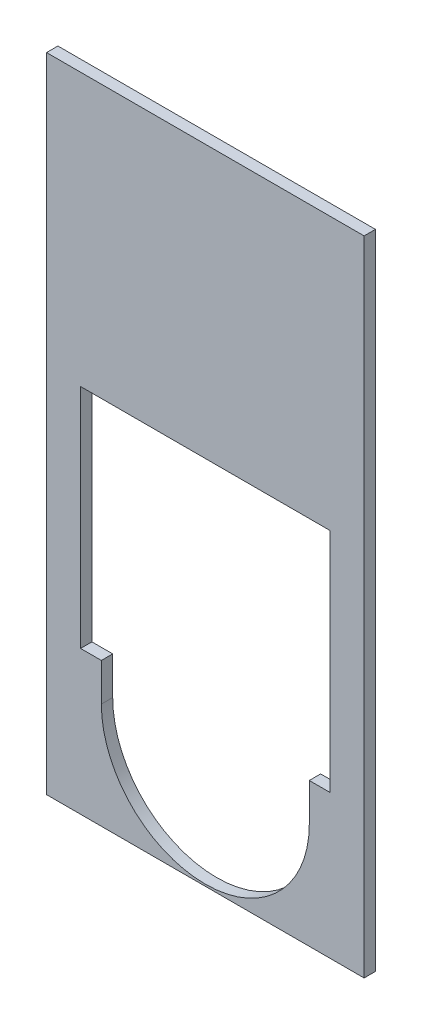
ISO-10303-21;
HEADER;
FILE_DESCRIPTION(('STEP AP214'),'2;1');
FILE_NAME('part.step','',(''),(''),'','','');
FILE_SCHEMA(('AUTOMOTIVE_DESIGN { 1 0 10303 214 1 1 1 1 }'));
ENDSEC;
DATA;
#1=APPLICATION_CONTEXT('core data for automotive mechanical design processes');
#2=APPLICATION_PROTOCOL_DEFINITION('international standard','automotive_design',2000,#1);
#3=PRODUCT_CONTEXT('',#1,'mechanical');
#4=PRODUCT('Part','Part','',(#3));
#5=PRODUCT_RELATED_PRODUCT_CATEGORY('part','',(#4));
#6=PRODUCT_DEFINITION_FORMATION('','',#4);
#7=PRODUCT_DEFINITION_CONTEXT('part definition',#1,'design');
#8=PRODUCT_DEFINITION('design','',#6,#7);
#9=PRODUCT_DEFINITION_SHAPE('','',#8);
#10=(LENGTH_UNIT() NAMED_UNIT(*) SI_UNIT(.MILLI.,.METRE.));
#11=(NAMED_UNIT(*) PLANE_ANGLE_UNIT() SI_UNIT($,.RADIAN.));
#12=(NAMED_UNIT(*) SI_UNIT($,.STERADIAN.) SOLID_ANGLE_UNIT());
#13=UNCERTAINTY_MEASURE_WITH_UNIT(LENGTH_MEASURE(1.E-05),#10,'distance_accuracy_value','');
#14=(GEOMETRIC_REPRESENTATION_CONTEXT(3) GLOBAL_UNCERTAINTY_ASSIGNED_CONTEXT((#13)) GLOBAL_UNIT_ASSIGNED_CONTEXT((#10,
#11,#12)) REPRESENTATION_CONTEXT('',''));
#15=CARTESIAN_POINT('',(0.,0.,0.));
#16=DIRECTION('',(0.,0.,1.));
#17=DIRECTION('',(1.,0.,0.));
#18=AXIS2_PLACEMENT_3D('',#15,#16,#17);
#19=CARTESIAN_POINT('',(0.,0.,3.));
#20=DIRECTION('',(1.,0.,0.));
#21=DIRECTION('',(0.,1.,0.));
#22=AXIS2_PLACEMENT_3D('',#19,#20,#21);
#23=PLANE('',#22);
#24=DIRECTION('',(0.,-1.,0.));
#25=VECTOR('',#24,1.);
#26=CARTESIAN_POINT('',(0.,0.,0.));
#27=LINE('',#26,#25);
#28=CARTESIAN_POINT('',(0.,170.,0.));
#29=VERTEX_POINT('',#28);
#30=CARTESIAN_POINT('',(0.,0.,0.));
#31=VERTEX_POINT('',#30);
#32=EDGE_CURVE('E176',#29,#31,#27,.T.);
#33=ORIENTED_EDGE('',*,*,#32,.T.);
#34=DIRECTION('',(0.,0.,-1.));
#35=VECTOR('',#34,1.);
#36=CARTESIAN_POINT('',(0.,0.,3.));
#37=LINE('',#36,#35);
#38=CARTESIAN_POINT('',(0.,0.,3.));
#39=VERTEX_POINT('',#38);
#40=EDGE_CURVE('E11',#39,#31,#37,.T.);
#41=ORIENTED_EDGE('',*,*,#40,.F.);
#42=DIRECTION('',(0.,-1.,0.));
#43=VECTOR('',#42,1.);
#44=CARTESIAN_POINT('',(0.,0.,3.));
#45=LINE('',#44,#43);
#46=CARTESIAN_POINT('',(0.,170.,3.));
#47=VERTEX_POINT('',#46);
#48=EDGE_CURVE('E188',#47,#39,#45,.T.);
#49=ORIENTED_EDGE('',*,*,#48,.F.);
#50=DIRECTION('',(0.,0.,-1.));
#51=VECTOR('',#50,1.);
#52=CARTESIAN_POINT('',(0.,170.,3.));
#53=LINE('',#52,#51);
#54=EDGE_CURVE('E198',#47,#29,#53,.T.);
#55=ORIENTED_EDGE('',*,*,#54,.T.);
#56=EDGE_LOOP('',(#33,#41,#49,#55));
#57=FACE_BOUND('',#56,.T.);
#58=ADVANCED_FACE('F32',(#57),#23,.F.);
#59=CARTESIAN_POINT('',(0.,0.,3.));
#60=DIRECTION('',(0.,1.,0.));
#61=DIRECTION('',(0.,0.,1.));
#62=AXIS2_PLACEMENT_3D('',#59,#60,#61);
#63=PLANE('',#62);
#64=DIRECTION('',(1.,0.,0.));
#65=VECTOR('',#64,1.);
#66=CARTESIAN_POINT('',(0.,0.,0.));
#67=LINE('',#66,#65);
#68=CARTESIAN_POINT('',(84.,0.,0.));
#69=VERTEX_POINT('',#68);
#70=EDGE_CURVE('E201',#31,#69,#67,.T.);
#71=ORIENTED_EDGE('',*,*,#70,.T.);
#72=DIRECTION('',(0.,0.,-1.));
#73=VECTOR('',#72,1.);
#74=CARTESIAN_POINT('',(84.,0.,3.));
#75=LINE('',#74,#73);
#76=CARTESIAN_POINT('',(84.,0.,3.));
#77=VERTEX_POINT('',#76);
#78=EDGE_CURVE('E39',#77,#69,#75,.T.);
#79=ORIENTED_EDGE('',*,*,#78,.F.);
#80=DIRECTION('',(1.,0.,0.));
#81=VECTOR('',#80,1.);
#82=CARTESIAN_POINT('',(0.,0.,3.));
#83=LINE('',#82,#81);
#84=EDGE_CURVE('E191',#39,#77,#83,.T.);
#85=ORIENTED_EDGE('',*,*,#84,.F.);
#86=ORIENTED_EDGE('',*,*,#40,.T.);
#87=EDGE_LOOP('',(#71,#79,#85,#86));
#88=FACE_BOUND('',#87,.T.);
#89=ADVANCED_FACE('F229',(#88),#63,.F.);
#90=CARTESIAN_POINT('',(84.,0.,3.));
#91=DIRECTION('',(-1.,0.,0.));
#92=DIRECTION('',(0.,-1.,0.));
#93=AXIS2_PLACEMENT_3D('',#90,#91,#92);
#94=PLANE('',#93);
#95=DIRECTION('',(0.,1.,0.));
#96=VECTOR('',#95,1.);
#97=CARTESIAN_POINT('',(84.,0.,0.));
#98=LINE('',#97,#96);
#99=CARTESIAN_POINT('',(84.,170.,0.));
#100=VERTEX_POINT('',#99);
#101=EDGE_CURVE('E203',#69,#100,#98,.T.);
#102=ORIENTED_EDGE('',*,*,#101,.T.);
#103=DIRECTION('',(0.,0.,-1.));
#104=VECTOR('',#103,1.);
#105=CARTESIAN_POINT('',(84.,170.,3.));
#106=LINE('',#105,#104);
#107=CARTESIAN_POINT('',(84.,170.,3.));
#108=VERTEX_POINT('',#107);
#109=EDGE_CURVE('E208',#108,#100,#106,.T.);
#110=ORIENTED_EDGE('',*,*,#109,.F.);
#111=DIRECTION('',(0.,1.,0.));
#112=VECTOR('',#111,1.);
#113=CARTESIAN_POINT('',(84.,0.,3.));
#114=LINE('',#113,#112);
#115=EDGE_CURVE('E194',#77,#108,#114,.T.);
#116=ORIENTED_EDGE('',*,*,#115,.F.);
#117=ORIENTED_EDGE('',*,*,#78,.T.);
#118=EDGE_LOOP('',(#102,#110,#116,#117));
#119=FACE_BOUND('',#118,.T.);
#120=ADVANCED_FACE('F215',(#119),#94,.F.);
#121=CARTESIAN_POINT('',(0.,170.,3.));
#122=DIRECTION('',(0.,-1.,0.));
#123=DIRECTION('',(0.,0.,-1.));
#124=AXIS2_PLACEMENT_3D('',#121,#122,#123);
#125=PLANE('',#124);
#126=DIRECTION('',(-1.,0.,0.));
#127=VECTOR('',#126,1.);
#128=CARTESIAN_POINT('',(0.,170.,0.));
#129=LINE('',#128,#127);
#130=EDGE_CURVE('E192',#100,#29,#129,.T.);
#131=ORIENTED_EDGE('',*,*,#130,.T.);
#132=ORIENTED_EDGE('',*,*,#54,.F.);
#133=DIRECTION('',(-1.,0.,0.));
#134=VECTOR('',#133,1.);
#135=CARTESIAN_POINT('',(0.,170.,3.));
#136=LINE('',#135,#134);
#137=EDGE_CURVE('E196',#108,#47,#136,.T.);
#138=ORIENTED_EDGE('',*,*,#137,.F.);
#139=ORIENTED_EDGE('',*,*,#109,.T.);
#140=EDGE_LOOP('',(#131,#132,#138,#139));
#141=FACE_BOUND('',#140,.T.);
#142=ADVANCED_FACE('F222',(#141),#125,.F.);
#143=CARTESIAN_POINT('',(0.,0.,3.));
#144=DIRECTION('',(0.,0.,-1.));
#145=DIRECTION('',(-1.,0.,0.));
#146=AXIS2_PLACEMENT_3D('',#143,#144,#145);
#147=PLANE('',#146);
#148=DIRECTION('',(0.,1.,0.));
#149=VECTOR('',#148,1.);
#150=CARTESIAN_POINT('',(14.5,0.,3.));
#151=LINE('',#150,#149);
#152=CARTESIAN_POINT('',(14.5,28.,3.));
#153=VERTEX_POINT('',#152);
#154=CARTESIAN_POINT('',(14.5,38.,3.));
#155=VERTEX_POINT('',#154);
#156=EDGE_CURVE('E160',#153,#155,#151,.T.);
#157=ORIENTED_EDGE('',*,*,#156,.T.);
#158=DIRECTION('',(1.,0.,0.));
#159=VECTOR('',#158,1.);
#160=CARTESIAN_POINT('',(0.,38.,3.));
#161=LINE('',#160,#159);
#162=CARTESIAN_POINT('',(9.00000000000001,38.,3.));
#163=VERTEX_POINT('',#162);
#164=EDGE_CURVE('E46',#163,#155,#161,.T.);
#165=ORIENTED_EDGE('',*,*,#164,.F.);
#166=DIRECTION('',(0.,-1.,0.));
#167=VECTOR('',#166,1.);
#168=CARTESIAN_POINT('',(9.00000000000002,0.,3.));
#169=LINE('',#168,#167);
#170=CARTESIAN_POINT('',(9.00000000000001,98.,3.));
#171=VERTEX_POINT('',#170);
#172=EDGE_CURVE('E139',#171,#163,#169,.T.);
#173=ORIENTED_EDGE('',*,*,#172,.F.);
#174=DIRECTION('',(1.,0.,0.));
#175=VECTOR('',#174,1.);
#176=CARTESIAN_POINT('',(0.,98.,3.));
#177=LINE('',#176,#175);
#178=CARTESIAN_POINT('',(75.,98.,3.));
#179=VERTEX_POINT('',#178);
#180=EDGE_CURVE('E143',#171,#179,#177,.T.);
#181=ORIENTED_EDGE('',*,*,#180,.T.);
#182=DIRECTION('',(0.,-1.,0.));
#183=VECTOR('',#182,1.);
#184=CARTESIAN_POINT('',(75.,0.,3.));
#185=LINE('',#184,#183);
#186=CARTESIAN_POINT('',(75.,38.,3.));
#187=VERTEX_POINT('',#186);
#188=EDGE_CURVE('E169',#179,#187,#185,.T.);
#189=ORIENTED_EDGE('',*,*,#188,.T.);
#190=CARTESIAN_POINT('',(69.5,38.,3.));
#191=VERTEX_POINT('',#190);
#192=EDGE_CURVE('E161',#191,#187,#161,.T.);
#193=ORIENTED_EDGE('',*,*,#192,.F.);
#194=DIRECTION('',(0.,1.,0.));
#195=VECTOR('',#194,1.);
#196=CARTESIAN_POINT('',(69.5,0.,3.));
#197=LINE('',#196,#195);
#198=CARTESIAN_POINT('',(69.5,28.,3.));
#199=VERTEX_POINT('',#198);
#200=EDGE_CURVE('E166',#199,#191,#197,.T.);
#201=ORIENTED_EDGE('',*,*,#200,.F.);
#202=CARTESIAN_POINT('',(42.,28.,3.));
#203=DIRECTION('',(0.,0.,1.));
#204=DIRECTION('',(1.,0.,0.));
#205=AXIS2_PLACEMENT_3D('',#202,#203,#204);
#206=CIRCLE('',#205,27.5);
#207=EDGE_CURVE('E163',#153,#199,#206,.T.);
#208=ORIENTED_EDGE('',*,*,#207,.F.);
#209=EDGE_LOOP('',(#157,#165,#173,#181,#189,#193,#201,#208));
#210=FACE_BOUND('',#209,.T.);
#211=ORIENTED_EDGE('',*,*,#48,.T.);
#212=ORIENTED_EDGE('',*,*,#84,.T.);
#213=ORIENTED_EDGE('',*,*,#115,.T.);
#214=ORIENTED_EDGE('',*,*,#137,.T.);
#215=EDGE_LOOP('',(#211,#212,#213,#214));
#216=FACE_BOUND('',#215,.T.);
#217=ADVANCED_FACE('F228',(#210,#216),#147,.F.);
#218=CARTESIAN_POINT('',(0.,0.,0.));
#219=DIRECTION('',(0.,0.,-1.));
#220=DIRECTION('',(-1.,0.,0.));
#221=AXIS2_PLACEMENT_3D('',#218,#219,#220);
#222=PLANE('',#221);
#223=DIRECTION('',(1.,0.,0.));
#224=VECTOR('',#223,1.);
#225=CARTESIAN_POINT('',(0.,38.,0.));
#226=LINE('',#225,#224);
#227=CARTESIAN_POINT('',(9.00000000000001,38.,0.));
#228=VERTEX_POINT('',#227);
#229=CARTESIAN_POINT('',(14.5,38.,0.));
#230=VERTEX_POINT('',#229);
#231=EDGE_CURVE('E128',#228,#230,#226,.T.);
#232=ORIENTED_EDGE('',*,*,#231,.T.);
#233=DIRECTION('',(0.,1.,0.));
#234=VECTOR('',#233,1.);
#235=CARTESIAN_POINT('',(14.5,0.,0.));
#236=LINE('',#235,#234);
#237=CARTESIAN_POINT('',(14.5,28.,0.));
#238=VERTEX_POINT('',#237);
#239=EDGE_CURVE('E120',#238,#230,#236,.T.);
#240=ORIENTED_EDGE('',*,*,#239,.F.);
#241=CARTESIAN_POINT('',(42.,28.,0.));
#242=DIRECTION('',(0.,0.,1.));
#243=DIRECTION('',(1.,0.,0.));
#244=AXIS2_PLACEMENT_3D('',#241,#242,#243);
#245=CIRCLE('',#244,27.5);
#246=CARTESIAN_POINT('',(69.5,28.,0.));
#247=VERTEX_POINT('',#246);
#248=EDGE_CURVE('E54',#238,#247,#245,.T.);
#249=ORIENTED_EDGE('',*,*,#248,.T.);
#250=DIRECTION('',(0.,1.,0.));
#251=VECTOR('',#250,1.);
#252=CARTESIAN_POINT('',(69.5,0.,0.));
#253=LINE('',#252,#251);
#254=CARTESIAN_POINT('',(69.5,38.,0.));
#255=VERTEX_POINT('',#254);
#256=EDGE_CURVE('E147',#247,#255,#253,.T.);
#257=ORIENTED_EDGE('',*,*,#256,.T.);
#258=CARTESIAN_POINT('',(75.,38.,0.));
#259=VERTEX_POINT('',#258);
#260=EDGE_CURVE('E141',#255,#259,#226,.T.);
#261=ORIENTED_EDGE('',*,*,#260,.T.);
#262=DIRECTION('',(0.,-1.,0.));
#263=VECTOR('',#262,1.);
#264=CARTESIAN_POINT('',(75.,0.,0.));
#265=LINE('',#264,#263);
#266=CARTESIAN_POINT('',(75.,98.,0.));
#267=VERTEX_POINT('',#266);
#268=EDGE_CURVE('E146',#267,#259,#265,.T.);
#269=ORIENTED_EDGE('',*,*,#268,.F.);
#270=DIRECTION('',(1.,0.,0.));
#271=VECTOR('',#270,1.);
#272=CARTESIAN_POINT('',(0.,98.,0.));
#273=LINE('',#272,#271);
#274=CARTESIAN_POINT('',(9.00000000000001,98.,0.));
#275=VERTEX_POINT('',#274);
#276=EDGE_CURVE('E151',#275,#267,#273,.T.);
#277=ORIENTED_EDGE('',*,*,#276,.F.);
#278=DIRECTION('',(0.,-1.,0.));
#279=VECTOR('',#278,1.);
#280=CARTESIAN_POINT('',(9.00000000000002,0.,0.));
#281=LINE('',#280,#279);
#282=EDGE_CURVE('E133',#275,#228,#281,.T.);
#283=ORIENTED_EDGE('',*,*,#282,.T.);
#284=EDGE_LOOP('',(#232,#240,#249,#257,#261,#269,#277,#283));
#285=FACE_BOUND('',#284,.T.);
#286=ORIENTED_EDGE('',*,*,#32,.F.);
#287=ORIENTED_EDGE('',*,*,#130,.F.);
#288=ORIENTED_EDGE('',*,*,#101,.F.);
#289=ORIENTED_EDGE('',*,*,#70,.F.);
#290=EDGE_LOOP('',(#286,#287,#288,#289));
#291=FACE_BOUND('',#290,.T.);
#292=ADVANCED_FACE('F135',(#285,#291),#222,.T.);
#293=CARTESIAN_POINT('',(0.,38.,0.));
#294=DIRECTION('',(0.,-1.,0.));
#295=DIRECTION('',(0.,0.,-1.));
#296=AXIS2_PLACEMENT_3D('',#293,#294,#295);
#297=PLANE('',#296);
#298=ORIENTED_EDGE('',*,*,#164,.T.);
#299=DIRECTION('',(0.,0.,1.));
#300=VECTOR('',#299,1.);
#301=CARTESIAN_POINT('',(14.5,38.,0.));
#302=LINE('',#301,#300);
#303=EDGE_CURVE('E123',#230,#155,#302,.T.);
#304=ORIENTED_EDGE('',*,*,#303,.F.);
#305=ORIENTED_EDGE('',*,*,#231,.F.);
#306=DIRECTION('',(0.,0.,1.));
#307=VECTOR('',#306,1.);
#308=CARTESIAN_POINT('',(9.00000000000001,38.,0.));
#309=LINE('',#308,#307);
#310=EDGE_CURVE('E174',#228,#163,#309,.T.);
#311=ORIENTED_EDGE('',*,*,#310,.T.);
#312=EDGE_LOOP('',(#298,#304,#305,#311));
#313=FACE_BOUND('',#312,.T.);
#314=ADVANCED_FACE('F131',(#313),#297,.F.);
#315=CARTESIAN_POINT('',(9.00000000000002,0.,0.));
#316=DIRECTION('',(-1.,0.,0.));
#317=DIRECTION('',(0.,-1.,0.));
#318=AXIS2_PLACEMENT_3D('',#315,#316,#317);
#319=PLANE('',#318);
#320=ORIENTED_EDGE('',*,*,#172,.T.);
#321=ORIENTED_EDGE('',*,*,#310,.F.);
#322=ORIENTED_EDGE('',*,*,#282,.F.);
#323=DIRECTION('',(0.,0.,1.));
#324=VECTOR('',#323,1.);
#325=CARTESIAN_POINT('',(9.00000000000001,98.,0.));
#326=LINE('',#325,#324);
#327=EDGE_CURVE('E177',#275,#171,#326,.T.);
#328=ORIENTED_EDGE('',*,*,#327,.T.);
#329=EDGE_LOOP('',(#320,#321,#322,#328));
#330=FACE_BOUND('',#329,.T.);
#331=ADVANCED_FACE('F264',(#330),#319,.F.);
#332=CARTESIAN_POINT('',(0.,98.,0.));
#333=DIRECTION('',(0.,-1.,0.));
#334=DIRECTION('',(0.,0.,-1.));
#335=AXIS2_PLACEMENT_3D('',#332,#333,#334);
#336=PLANE('',#335);
#337=ORIENTED_EDGE('',*,*,#180,.F.);
#338=ORIENTED_EDGE('',*,*,#327,.F.);
#339=ORIENTED_EDGE('',*,*,#276,.T.);
#340=DIRECTION('',(0.,0.,1.));
#341=VECTOR('',#340,1.);
#342=CARTESIAN_POINT('',(75.,98.,0.));
#343=LINE('',#342,#341);
#344=EDGE_CURVE('E179',#267,#179,#343,.T.);
#345=ORIENTED_EDGE('',*,*,#344,.T.);
#346=EDGE_LOOP('',(#337,#338,#339,#345));
#347=FACE_BOUND('',#346,.T.);
#348=ADVANCED_FACE('F260',(#347),#336,.T.);
#349=CARTESIAN_POINT('',(75.,0.,0.));
#350=DIRECTION('',(-1.,0.,0.));
#351=DIRECTION('',(0.,0.,1.));
#352=AXIS2_PLACEMENT_3D('',#349,#350,#351);
#353=PLANE('',#352);
#354=ORIENTED_EDGE('',*,*,#188,.F.);
#355=ORIENTED_EDGE('',*,*,#344,.F.);
#356=ORIENTED_EDGE('',*,*,#268,.T.);
#357=DIRECTION('',(0.,0.,1.));
#358=VECTOR('',#357,1.);
#359=CARTESIAN_POINT('',(75.,38.,0.));
#360=LINE('',#359,#358);
#361=EDGE_CURVE('E181',#259,#187,#360,.T.);
#362=ORIENTED_EDGE('',*,*,#361,.T.);
#363=EDGE_LOOP('',(#354,#355,#356,#362));
#364=FACE_BOUND('',#363,.T.);
#365=ADVANCED_FACE('F256',(#364),#353,.T.);
#366=ORIENTED_EDGE('',*,*,#192,.T.);
#367=ORIENTED_EDGE('',*,*,#361,.F.);
#368=ORIENTED_EDGE('',*,*,#260,.F.);
#369=DIRECTION('',(0.,0.,1.));
#370=VECTOR('',#369,1.);
#371=CARTESIAN_POINT('',(69.5,38.,0.));
#372=LINE('',#371,#370);
#373=EDGE_CURVE('E183',#255,#191,#372,.T.);
#374=ORIENTED_EDGE('',*,*,#373,.T.);
#375=EDGE_LOOP('',(#366,#367,#368,#374));
#376=FACE_BOUND('',#375,.T.);
#377=ADVANCED_FACE('F252',(#376),#297,.F.);
#378=CARTESIAN_POINT('',(69.5,0.,0.));
#379=DIRECTION('',(1.,0.,0.));
#380=DIRECTION('',(0.,0.,-1.));
#381=AXIS2_PLACEMENT_3D('',#378,#379,#380);
#382=PLANE('',#381);
#383=ORIENTED_EDGE('',*,*,#200,.T.);
#384=ORIENTED_EDGE('',*,*,#373,.F.);
#385=ORIENTED_EDGE('',*,*,#256,.F.);
#386=DIRECTION('',(0.,0.,1.));
#387=VECTOR('',#386,1.);
#388=CARTESIAN_POINT('',(69.5,28.,0.));
#389=LINE('',#388,#387);
#390=EDGE_CURVE('E185',#247,#199,#389,.T.);
#391=ORIENTED_EDGE('',*,*,#390,.T.);
#392=EDGE_LOOP('',(#383,#384,#385,#391));
#393=FACE_BOUND('',#392,.T.);
#394=ADVANCED_FACE('F249',(#393),#382,.F.);
#395=CARTESIAN_POINT('',(42.,28.,0.));
#396=DIRECTION('',(0.,0.,1.));
#397=DIRECTION('',(1.,0.,0.));
#398=AXIS2_PLACEMENT_3D('',#395,#396,#397);
#399=CYLINDRICAL_SURFACE('',#398,27.5);
#400=ORIENTED_EDGE('',*,*,#207,.T.);
#401=ORIENTED_EDGE('',*,*,#390,.F.);
#402=ORIENTED_EDGE('',*,*,#248,.F.);
#403=DIRECTION('',(0.,0.,1.));
#404=VECTOR('',#403,1.);
#405=CARTESIAN_POINT('',(14.5,28.,0.));
#406=LINE('',#405,#404);
#407=EDGE_CURVE('E125',#238,#153,#406,.T.);
#408=ORIENTED_EDGE('',*,*,#407,.T.);
#409=EDGE_LOOP('',(#400,#401,#402,#408));
#410=FACE_BOUND('',#409,.T.);
#411=ADVANCED_FACE('F246',(#410),#399,.F.);
#412=CARTESIAN_POINT('',(14.5,0.,0.));
#413=DIRECTION('',(1.,0.,0.));
#414=DIRECTION('',(0.,0.,-1.));
#415=AXIS2_PLACEMENT_3D('',#412,#413,#414);
#416=PLANE('',#415);
#417=ORIENTED_EDGE('',*,*,#156,.F.);
#418=ORIENTED_EDGE('',*,*,#407,.F.);
#419=ORIENTED_EDGE('',*,*,#239,.T.);
#420=ORIENTED_EDGE('',*,*,#303,.T.);
#421=EDGE_LOOP('',(#417,#418,#419,#420));
#422=FACE_BOUND('',#421,.T.);
#423=ADVANCED_FACE('F122',(#422),#416,.T.);
#424=CLOSED_SHELL('',(#58,#89,#120,#142,#217,#292,#314,#331,#348,#365,#377,#394,#411,#423));
#425=MANIFOLD_SOLID_BREP('B2',#424);
#426=ADVANCED_BREP_SHAPE_REPRESENTATION('',(#18,#425),#14);
#427=SHAPE_DEFINITION_REPRESENTATION(#9,#426);
ENDSEC;
END-ISO-10303-21;
